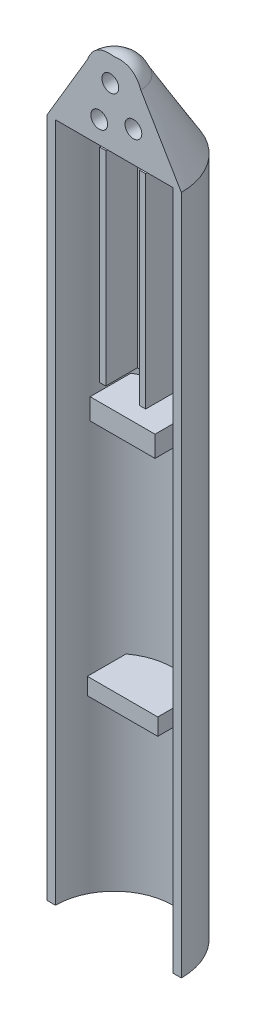
ISO-10303-21;
HEADER;
FILE_DESCRIPTION(('STEP AP214'),'2;1');
FILE_NAME('part.step','',(''),(''),'','','');
FILE_SCHEMA(('AUTOMOTIVE_DESIGN { 1 0 10303 214 1 1 1 1 }'));
ENDSEC;
DATA;
#1=APPLICATION_CONTEXT('core data for automotive mechanical design processes');
#2=APPLICATION_PROTOCOL_DEFINITION('international standard','automotive_design',2000,#1);
#3=PRODUCT_CONTEXT('',#1,'mechanical');
#4=PRODUCT('Part','Part','',(#3));
#5=PRODUCT_RELATED_PRODUCT_CATEGORY('part','',(#4));
#6=PRODUCT_DEFINITION_FORMATION('','',#4);
#7=PRODUCT_DEFINITION_CONTEXT('part definition',#1,'design');
#8=PRODUCT_DEFINITION('design','',#6,#7);
#9=PRODUCT_DEFINITION_SHAPE('','',#8);
#10=(LENGTH_UNIT() NAMED_UNIT(*) SI_UNIT(.MILLI.,.METRE.));
#11=(NAMED_UNIT(*) PLANE_ANGLE_UNIT() SI_UNIT($,.RADIAN.));
#12=(NAMED_UNIT(*) SI_UNIT($,.STERADIAN.) SOLID_ANGLE_UNIT());
#13=UNCERTAINTY_MEASURE_WITH_UNIT(LENGTH_MEASURE(1.E-05),#10,'distance_accuracy_value','');
#14=(GEOMETRIC_REPRESENTATION_CONTEXT(3) GLOBAL_UNCERTAINTY_ASSIGNED_CONTEXT((#13)) GLOBAL_UNIT_ASSIGNED_CONTEXT((#10,
#11,#12)) REPRESENTATION_CONTEXT('',''));
#15=CARTESIAN_POINT('',(0.,0.,0.));
#16=DIRECTION('',(0.,0.,1.));
#17=DIRECTION('',(1.,0.,0.));
#18=AXIS2_PLACEMENT_3D('',#15,#16,#17);
#19=CARTESIAN_POINT('',(-3.99999999999998,0.,-16.002));
#20=DIRECTION('',(1.,0.,0.));
#21=DIRECTION('',(0.,0.,-1.));
#22=AXIS2_PLACEMENT_3D('',#19,#20,#21);
#23=PLANE('',#22);
#24=DIRECTION('',(0.,0.,1.));
#25=VECTOR('',#24,1.);
#26=CARTESIAN_POINT('',(-3.99999999999998,20.0675731061453,-16.002));
#27=LINE('',#26,#25);
#28=CARTESIAN_POINT('',(-3.99999999999998,20.0675731061453,-9.5));
#29=VERTEX_POINT('',#28);
#30=CARTESIAN_POINT('',(-3.99999999999998,20.0675731061453,-2.));
#31=VERTEX_POINT('',#30);
#32=EDGE_CURVE('E66',#29,#31,#27,.T.);
#33=ORIENTED_EDGE('',*,*,#32,.F.);
#34=DIRECTION('',(0.,1.,0.));
#35=VECTOR('',#34,1.);
#36=CARTESIAN_POINT('',(-3.99999999999998,0.,-9.5));
#37=LINE('',#36,#35);
#38=CARTESIAN_POINT('',(-3.99999999999998,68.6220349905325,-9.5));
#39=VERTEX_POINT('',#38);
#40=EDGE_CURVE('E223',#29,#39,#37,.T.);
#41=ORIENTED_EDGE('',*,*,#40,.T.);
#42=DIRECTION('',(0.,0.,1.));
#43=VECTOR('',#42,1.);
#44=CARTESIAN_POINT('',(-3.99999999999998,68.6220349905325,-16.002));
#45=LINE('',#44,#43);
#46=CARTESIAN_POINT('',(-3.99999999999998,68.6220349905325,-2.));
#47=VERTEX_POINT('',#46);
#48=EDGE_CURVE('E212',#39,#47,#45,.T.);
#49=ORIENTED_EDGE('',*,*,#48,.T.);
#50=DIRECTION('',(0.,1.,0.));
#51=VECTOR('',#50,1.);
#52=CARTESIAN_POINT('',(-3.99999999999998,0.,-2.));
#53=LINE('',#52,#51);
#54=EDGE_CURVE('E240',#31,#47,#53,.T.);
#55=ORIENTED_EDGE('',*,*,#54,.F.);
#56=EDGE_LOOP('',(#33,#41,#49,#55));
#57=FACE_BOUND('',#56,.T.);
#58=ADVANCED_FACE('F47',(#57),#23,.T.);
#59=CARTESIAN_POINT('',(3.99999999999998,0.,-16.002));
#60=DIRECTION('',(1.,0.,0.));
#61=DIRECTION('',(0.,0.,-1.));
#62=AXIS2_PLACEMENT_3D('',#59,#60,#61);
#63=PLANE('',#62);
#64=DIRECTION('',(0.,1.,0.));
#65=VECTOR('',#64,1.);
#66=CARTESIAN_POINT('',(3.99999999999998,0.,-9.5));
#67=LINE('',#66,#65);
#68=CARTESIAN_POINT('',(3.99999999999998,20.0675731061453,-9.5));
#69=VERTEX_POINT('',#68);
#70=CARTESIAN_POINT('',(3.99999999999998,68.6220349905325,-9.5));
#71=VERTEX_POINT('',#70);
#72=EDGE_CURVE('E74',#69,#71,#67,.T.);
#73=ORIENTED_EDGE('',*,*,#72,.F.);
#74=DIRECTION('',(0.,0.,1.));
#75=VECTOR('',#74,1.);
#76=CARTESIAN_POINT('',(3.99999999999998,20.0675731061453,-16.002));
#77=LINE('',#76,#75);
#78=CARTESIAN_POINT('',(3.99999999999998,20.0675731061453,-2.));
#79=VERTEX_POINT('',#78);
#80=EDGE_CURVE('E316',#69,#79,#77,.T.);
#81=ORIENTED_EDGE('',*,*,#80,.T.);
#82=DIRECTION('',(0.,1.,0.));
#83=VECTOR('',#82,1.);
#84=CARTESIAN_POINT('',(3.99999999999998,0.,-2.));
#85=LINE('',#84,#83);
#86=CARTESIAN_POINT('',(3.99999999999998,68.6220349905325,-2.));
#87=VERTEX_POINT('',#86);
#88=EDGE_CURVE('E197',#79,#87,#85,.T.);
#89=ORIENTED_EDGE('',*,*,#88,.T.);
#90=DIRECTION('',(0.,0.,1.));
#91=VECTOR('',#90,1.);
#92=CARTESIAN_POINT('',(3.99999999999998,68.6220349905325,-16.002));
#93=LINE('',#92,#91);
#94=EDGE_CURVE('E191',#71,#87,#93,.T.);
#95=ORIENTED_EDGE('',*,*,#94,.F.);
#96=EDGE_LOOP('',(#73,#81,#89,#95));
#97=FACE_BOUND('',#96,.T.);
#98=ADVANCED_FACE('F196',(#97),#63,.F.);
#99=CARTESIAN_POINT('',(0.,91.,0.));
#100=DIRECTION('',(0.,1.,0.));
#101=DIRECTION('',(-1.,0.,0.));
#102=AXIS2_PLACEMENT_3D('',#99,#100,#101);
#103=CYLINDRICAL_SURFACE('',#102,14.);
#104=CARTESIAN_POINT('',(0.,-42.,0.));
#105=DIRECTION('',(0.,-1.,0.));
#106=DIRECTION('',(0.,0.,-1.));
#107=AXIS2_PLACEMENT_3D('',#104,#105,#106);
#108=CIRCLE('',#107,14.);
#109=CARTESIAN_POINT('',(-8.38159543616831,-42.,-11.2137798241451));
#110=VERTEX_POINT('',#109);
#111=CARTESIAN_POINT('',(8.38159543616828,-42.,-11.2137798241451));
#112=VERTEX_POINT('',#111);
#113=EDGE_CURVE('E292',#110,#112,#108,.T.);
#114=ORIENTED_EDGE('',*,*,#113,.T.);
#115=DIRECTION('',(0.,1.,0.));
#116=VECTOR('',#115,1.);
#117=CARTESIAN_POINT('',(8.38159543616828,91.,-11.2137798241451));
#118=LINE('',#117,#116);
#119=CARTESIAN_POINT('',(8.38159543616829,-46.,-11.2137798241451));
#120=VERTEX_POINT('',#119);
#121=EDGE_CURVE('E290',#120,#112,#118,.T.);
#122=ORIENTED_EDGE('',*,*,#121,.F.);
#123=CARTESIAN_POINT('',(0.,-46.,0.));
#124=DIRECTION('',(0.,-1.,0.));
#125=DIRECTION('',(0.,0.,-1.));
#126=AXIS2_PLACEMENT_3D('',#123,#124,#125);
#127=CIRCLE('',#126,14.);
#128=CARTESIAN_POINT('',(-8.38159543616832,-46.,-11.2137798241451));
#129=VERTEX_POINT('',#128);
#130=EDGE_CURVE('E294',#129,#120,#127,.T.);
#131=ORIENTED_EDGE('',*,*,#130,.F.);
#132=DIRECTION('',(0.,1.,0.));
#133=VECTOR('',#132,1.);
#134=CARTESIAN_POINT('',(-8.38159543616832,91.,-11.2137798241451));
#135=LINE('',#134,#133);
#136=EDGE_CURVE('E288',#129,#110,#135,.T.);
#137=ORIENTED_EDGE('',*,*,#136,.T.);
#138=EDGE_LOOP('',(#114,#122,#131,#137));
#139=FACE_BOUND('',#138,.T.);
#140=DIRECTION('',(0.,1.,0.));
#141=VECTOR('',#140,1.);
#142=CARTESIAN_POINT('',(14.,91.,0.));
#143=LINE('',#142,#141);
#144=CARTESIAN_POINT('',(14.,71.,0.));
#145=VERTEX_POINT('',#144);
#146=CARTESIAN_POINT('',(14.,-91.0399288571137,0.));
#147=VERTEX_POINT('',#146);
#148=EDGE_CURVE('E374',#145,#147,#143,.F.);
#149=ORIENTED_EDGE('',*,*,#148,.F.);
#150=CARTESIAN_POINT('',(0.,71.,0.));
#151=DIRECTION('',(0.,1.,0.));
#152=DIRECTION('',(-1.,0.,0.));
#153=AXIS2_PLACEMENT_3D('',#150,#151,#152);
#154=CIRCLE('',#153,14.);
#155=CARTESIAN_POINT('',(-14.,71.,0.));
#156=VERTEX_POINT('',#155);
#157=EDGE_CURVE('E56',#145,#156,#154,.T.);
#158=ORIENTED_EDGE('',*,*,#157,.T.);
#159=DIRECTION('',(0.,1.,0.));
#160=VECTOR('',#159,1.);
#161=CARTESIAN_POINT('',(-14.,91.,0.));
#162=LINE('',#161,#160);
#163=CARTESIAN_POINT('',(-14.,-91.0399288571137,0.));
#164=VERTEX_POINT('',#163);
#165=EDGE_CURVE('E365',#164,#156,#162,.T.);
#166=ORIENTED_EDGE('',*,*,#165,.F.);
#167=CARTESIAN_POINT('',(0.,-91.0399288571137,0.));
#168=DIRECTION('',(0.,1.,0.));
#169=DIRECTION('',(-1.,0.,0.));
#170=AXIS2_PLACEMENT_3D('',#167,#168,#169);
#171=CIRCLE('',#170,14.);
#172=EDGE_CURVE('E410',#147,#164,#171,.T.);
#173=ORIENTED_EDGE('',*,*,#172,.F.);
#174=EDGE_LOOP('',(#149,#158,#166,#173));
#175=FACE_BOUND('',#174,.T.);
#176=CARTESIAN_POINT('',(0.,16.,0.));
#177=DIRECTION('',(0.,-1.,0.));
#178=DIRECTION('',(1.,0.,0.));
#179=AXIS2_PLACEMENT_3D('',#176,#177,#178);
#180=CIRCLE('',#179,14.);
#181=CARTESIAN_POINT('',(-7.72890663595341,16.,-11.6732173034137));
#182=VERTEX_POINT('',#181);
#183=CARTESIAN_POINT('',(7.72890663595337,16.,-11.6732173034137));
#184=VERTEX_POINT('',#183);
#185=EDGE_CURVE('E361',#182,#184,#180,.T.);
#186=ORIENTED_EDGE('',*,*,#185,.T.);
#187=DIRECTION('',(0.,1.,0.));
#188=VECTOR('',#187,1.);
#189=CARTESIAN_POINT('',(7.72890663595337,91.,-11.6732173034136));
#190=LINE('',#189,#188);
#191=CARTESIAN_POINT('',(7.72890663595338,11.,-11.6732173034137));
#192=VERTEX_POINT('',#191);
#193=EDGE_CURVE('E356',#192,#184,#190,.T.);
#194=ORIENTED_EDGE('',*,*,#193,.F.);
#195=CARTESIAN_POINT('',(0.,11.,0.));
#196=DIRECTION('',(0.,-1.,0.));
#197=DIRECTION('',(1.,0.,0.));
#198=AXIS2_PLACEMENT_3D('',#195,#196,#197);
#199=CIRCLE('',#198,14.);
#200=CARTESIAN_POINT('',(-7.72890663595342,11.,-11.6732173034137));
#201=VERTEX_POINT('',#200);
#202=EDGE_CURVE('E366',#201,#192,#199,.T.);
#203=ORIENTED_EDGE('',*,*,#202,.F.);
#204=DIRECTION('',(0.,1.,0.));
#205=VECTOR('',#204,1.);
#206=CARTESIAN_POINT('',(-7.72890663595342,91.,-11.6732173034137));
#207=LINE('',#206,#205);
#208=EDGE_CURVE('E360',#201,#182,#207,.T.);
#209=ORIENTED_EDGE('',*,*,#208,.T.);
#210=EDGE_LOOP('',(#186,#194,#203,#209));
#211=FACE_BOUND('',#210,.T.);
#212=DIRECTION('',(0.,1.,0.));
#213=VECTOR('',#212,1.);
#214=CARTESIAN_POINT('',(-5.49999999999998,91.,-12.8743931895838));
#215=LINE('',#214,#213);
#216=CARTESIAN_POINT('',(-5.49999999999997,20.0675731061453,-12.8743931895838));
#217=VERTEX_POINT('',#216);
#218=CARTESIAN_POINT('',(-5.49999999999998,68.6220349905325,-12.8743931895838));
#219=VERTEX_POINT('',#218);
#220=EDGE_CURVE('E251',#217,#219,#215,.T.);
#221=ORIENTED_EDGE('',*,*,#220,.T.);
#222=CARTESIAN_POINT('',(0.,68.6220349905325,0.));
#223=DIRECTION('',(0.,1.,0.));
#224=DIRECTION('',(0.,0.,1.));
#225=AXIS2_PLACEMENT_3D('',#222,#223,#224);
#226=CIRCLE('',#225,14.);
#227=CARTESIAN_POINT('',(5.49999999999998,68.6220349905325,-12.8743931895837));
#228=VERTEX_POINT('',#227);
#229=EDGE_CURVE('E325',#228,#219,#226,.T.);
#230=ORIENTED_EDGE('',*,*,#229,.F.);
#231=DIRECTION('',(0.,1.,0.));
#232=VECTOR('',#231,1.);
#233=CARTESIAN_POINT('',(5.49999999999998,91.,-12.8743931895837));
#234=LINE('',#233,#232);
#235=CARTESIAN_POINT('',(5.49999999999998,20.0675731061453,-12.8743931895837));
#236=VERTEX_POINT('',#235);
#237=EDGE_CURVE('E323',#236,#228,#234,.T.);
#238=ORIENTED_EDGE('',*,*,#237,.F.);
#239=CARTESIAN_POINT('',(0.,20.0675731061453,0.));
#240=DIRECTION('',(0.,1.,0.));
#241=DIRECTION('',(0.,0.,1.));
#242=AXIS2_PLACEMENT_3D('',#239,#240,#241);
#243=CIRCLE('',#242,14.);
#244=EDGE_CURVE('E262',#236,#217,#243,.T.);
#245=ORIENTED_EDGE('',*,*,#244,.T.);
#246=EDGE_LOOP('',(#221,#230,#238,#245));
#247=FACE_BOUND('',#246,.T.);
#248=ADVANCED_FACE('F440',(#139,#175,#211,#247),#103,.F.);
#249=CARTESIAN_POINT('',(6.354000148981,87.2790396922268,0.));
#250=CARTESIAN_POINT('',(4.66858918472638,91.7236423414879,0.));
#251=CARTESIAN_POINT('',(0.,91.,0.));
#252=B_SPLINE_CURVE_WITH_KNOTS('',2,(#249,#250,#251),.UNSPECIFIED.,.F.,.F.,(3,3),(0.,1.),.UNSPECIFIED.);
#253=CARTESIAN_POINT('',(0.,91.,0.));
#254=DIRECTION('',(0.,1.,0.));
#255=AXIS1_PLACEMENT('',#253,#254);
#256=SURFACE_OF_REVOLUTION('',#252,#255);
#257=CARTESIAN_POINT('',(6.354000148981,87.2790396922268,0.));
#258=CARTESIAN_POINT('',(4.66858918472638,91.7236423414879,0.));
#259=CARTESIAN_POINT('',(0.,91.,0.));
#260=B_SPLINE_CURVE_WITH_KNOTS('',2,(#257,#258,#259),.UNSPECIFIED.,.F.,.F.,(3,3),(0.,1.),.UNSPECIFIED.);
#261=CARTESIAN_POINT('',(6.354000148981,87.2790396922268,0.));
#262=VERTEX_POINT('',#261);
#263=CARTESIAN_POINT('',(0.,91.,0.));
#264=VERTEX_POINT('',#263);
#265=EDGE_CURVE('E399',#262,#264,#260,.T.);
#266=ORIENTED_EDGE('',*,*,#265,.F.);
#267=CARTESIAN_POINT('',(0.,87.2790396922268,0.));
#268=DIRECTION('',(0.,1.,0.));
#269=DIRECTION('',(-1.,0.,0.));
#270=AXIS2_PLACEMENT_3D('',#267,#268,#269);
#271=CIRCLE('',#270,6.35400014898102);
#272=CARTESIAN_POINT('',(-6.35400014898104,87.2790396922268,0.));
#273=VERTEX_POINT('',#272);
#274=EDGE_CURVE('E423',#262,#273,#271,.T.);
#275=ORIENTED_EDGE('',*,*,#274,.T.);
#276=CARTESIAN_POINT('',(-6.35400014898105,87.2790396922268,0.));
#277=CARTESIAN_POINT('',(-4.66858918472643,91.7236423414879,0.));
#278=CARTESIAN_POINT('',(0.,91.,0.));
#279=B_SPLINE_CURVE_WITH_KNOTS('',2,(#276,#277,#278),.UNSPECIFIED.,.F.,.F.,(3,3),(0.,1.),.UNSPECIFIED.);
#280=EDGE_CURVE('E393',#264,#273,#279,.F.);
#281=ORIENTED_EDGE('',*,*,#280,.F.);
#282=EDGE_LOOP('',(#266,#275,#281));
#283=FACE_BOUND('',#282,.T.);
#284=ADVANCED_FACE('F51',(#283),#256,.T.);
#285=CARTESIAN_POINT('',(0.,71.,0.));
#286=DIRECTION('',(0.,-1.,0.));
#287=DIRECTION('',(1.,0.,0.));
#288=AXIS2_PLACEMENT_3D('',#285,#286,#287);
#289=CONICAL_SURFACE('',#288,16.,0.534916952487725);
#290=DIRECTION('',(-0.50976959450107,-0.860310967338099,0.));
#291=VECTOR('',#290,1.);
#292=CARTESIAN_POINT('',(0.,98.0023469934135,0.));
#293=LINE('',#292,#291);
#294=CARTESIAN_POINT('',(-16.,71.,0.));
#295=VERTEX_POINT('',#294);
#296=EDGE_CURVE('E391',#273,#295,#293,.T.);
#297=ORIENTED_EDGE('',*,*,#296,.F.);
#298=ORIENTED_EDGE('',*,*,#274,.F.);
#299=DIRECTION('',(-0.50976959450107,0.860310967338099,0.));
#300=VECTOR('',#299,1.);
#301=CARTESIAN_POINT('',(0.,98.0023469934135,0.));
#302=LINE('',#301,#300);
#303=CARTESIAN_POINT('',(16.,71.,0.));
#304=VERTEX_POINT('',#303);
#305=EDGE_CURVE('E389',#304,#262,#302,.T.);
#306=ORIENTED_EDGE('',*,*,#305,.F.);
#307=CARTESIAN_POINT('',(0.,71.,0.));
#308=DIRECTION('',(0.,1.,0.));
#309=DIRECTION('',(-1.,0.,0.));
#310=AXIS2_PLACEMENT_3D('',#307,#308,#309);
#311=CIRCLE('',#310,16.);
#312=EDGE_CURVE('E418',#304,#295,#311,.T.);
#313=ORIENTED_EDGE('',*,*,#312,.T.);
#314=EDGE_LOOP('',(#297,#298,#306,#313));
#315=FACE_BOUND('',#314,.T.);
#316=ADVANCED_FACE('F462',(#315),#289,.T.);
#317=CARTESIAN_POINT('',(0.,91.,0.));
#318=DIRECTION('',(0.,1.,0.));
#319=DIRECTION('',(-1.,0.,0.));
#320=AXIS2_PLACEMENT_3D('',#317,#318,#319);
#321=CYLINDRICAL_SURFACE('',#320,16.);
#322=DIRECTION('',(0.,1.,0.));
#323=VECTOR('',#322,1.);
#324=CARTESIAN_POINT('',(16.,91.,0.));
#325=LINE('',#324,#323);
#326=CARTESIAN_POINT('',(16.,-91.0399288571137,0.));
#327=VERTEX_POINT('',#326);
#328=EDGE_CURVE('E383',#327,#304,#325,.T.);
#329=ORIENTED_EDGE('',*,*,#328,.F.);
#330=CARTESIAN_POINT('',(0.,-91.0399288571137,0.));
#331=DIRECTION('',(0.,1.,0.));
#332=DIRECTION('',(-1.,0.,0.));
#333=AXIS2_PLACEMENT_3D('',#330,#331,#332);
#334=CIRCLE('',#333,16.);
#335=CARTESIAN_POINT('',(-16.,-91.0399288571137,0.));
#336=VERTEX_POINT('',#335);
#337=EDGE_CURVE('E413',#327,#336,#334,.T.);
#338=ORIENTED_EDGE('',*,*,#337,.T.);
#339=DIRECTION('',(0.,1.,0.));
#340=VECTOR('',#339,1.);
#341=CARTESIAN_POINT('',(-16.,91.,0.));
#342=LINE('',#341,#340);
#343=EDGE_CURVE('E385',#295,#336,#342,.F.);
#344=ORIENTED_EDGE('',*,*,#343,.F.);
#345=ORIENTED_EDGE('',*,*,#312,.F.);
#346=EDGE_LOOP('',(#329,#338,#344,#345));
#347=FACE_BOUND('',#346,.T.);
#348=ADVANCED_FACE('F451',(#347),#321,.T.);
#349=CARTESIAN_POINT('',(16.,-91.0399288571137,0.));
#350=DIRECTION('',(0.,1.,0.));
#351=DIRECTION('',(-1.,0.,0.));
#352=AXIS2_PLACEMENT_3D('',#349,#350,#351);
#353=PLANE('',#352);
#354=DIRECTION('',(1.,0.,0.));
#355=VECTOR('',#354,1.);
#356=CARTESIAN_POINT('',(16.,-91.0399288571137,0.));
#357=LINE('',#356,#355);
#358=EDGE_CURVE('E382',#336,#164,#357,.T.);
#359=ORIENTED_EDGE('',*,*,#358,.F.);
#360=ORIENTED_EDGE('',*,*,#337,.F.);
#361=EDGE_CURVE('E377',#147,#327,#357,.T.);
#362=ORIENTED_EDGE('',*,*,#361,.F.);
#363=ORIENTED_EDGE('',*,*,#172,.T.);
#364=EDGE_LOOP('',(#359,#360,#362,#363));
#365=FACE_BOUND('',#364,.T.);
#366=ADVANCED_FACE('F452',(#365),#353,.F.);
#367=CARTESIAN_POINT('',(16.,71.,0.));
#368=DIRECTION('',(0.,1.,0.));
#369=DIRECTION('',(-1.,0.,0.));
#370=AXIS2_PLACEMENT_3D('',#367,#368,#369);
#371=PLANE('',#370);
#372=DIRECTION('',(1.,0.,0.));
#373=VECTOR('',#372,1.);
#374=CARTESIAN_POINT('',(16.,71.,0.));
#375=LINE('',#374,#373);
#376=EDGE_CURVE('E11',#156,#145,#375,.T.);
#377=ORIENTED_EDGE('',*,*,#376,.F.);
#378=ORIENTED_EDGE('',*,*,#157,.F.);
#379=EDGE_LOOP('',(#377,#378));
#380=FACE_BOUND('',#379,.T.);
#381=ADVANCED_FACE('F445',(#380),#371,.F.);
#382=CARTESIAN_POINT('',(0.,0.,0.));
#383=DIRECTION('',(0.,0.,1.));
#384=DIRECTION('',(1.,0.,0.));
#385=AXIS2_PLACEMENT_3D('',#382,#383,#384);
#386=PLANE('',#385);
#387=CARTESIAN_POINT('',(4.57930185841874,78.3675125372892,0.));
#388=DIRECTION('',(0.,0.,1.));
#389=DIRECTION('',(1.,0.,0.));
#390=AXIS2_PLACEMENT_3D('',#387,#388,#389);
#391=CIRCLE('',#390,2.);
#392=CARTESIAN_POINT('',(6.57930185841874,78.3675125372892,0.));
#393=VERTEX_POINT('',#392);
#394=EDGE_CURVE('E740',#393,#393,#391,.T.);
#395=ORIENTED_EDGE('',*,*,#394,.F.);
#396=EDGE_LOOP('',(#395));
#397=FACE_BOUND('',#396,.T.);
#398=CARTESIAN_POINT('',(-3.55851338451132,76.2554078177501,0.));
#399=DIRECTION('',(0.,0.,1.));
#400=DIRECTION('',(1.,0.,0.));
#401=AXIS2_PLACEMENT_3D('',#398,#399,#400);
#402=CIRCLE('',#401,2.);
#403=CARTESIAN_POINT('',(-1.55851338451132,76.2554078177501,0.));
#404=VERTEX_POINT('',#403);
#405=EDGE_CURVE('E742',#404,#404,#402,.T.);
#406=ORIENTED_EDGE('',*,*,#405,.F.);
#407=EDGE_LOOP('',(#406));
#408=FACE_BOUND('',#407,.T.);
#409=CARTESIAN_POINT('',(-0.919296183297679,85.0765510581781,0.));
#410=DIRECTION('',(0.,0.,1.));
#411=DIRECTION('',(1.,0.,0.));
#412=AXIS2_PLACEMENT_3D('',#409,#410,#411);
#413=CIRCLE('',#412,2.);
#414=CARTESIAN_POINT('',(1.08070381670232,85.0765510581781,0.));
#415=VERTEX_POINT('',#414);
#416=EDGE_CURVE('E753',#415,#415,#413,.T.);
#417=ORIENTED_EDGE('',*,*,#416,.F.);
#418=EDGE_LOOP('',(#417));
#419=FACE_BOUND('',#418,.T.);
#420=ORIENTED_EDGE('',*,*,#265,.T.);
#421=ORIENTED_EDGE('',*,*,#280,.T.);
#422=ORIENTED_EDGE('',*,*,#296,.T.);
#423=ORIENTED_EDGE('',*,*,#343,.T.);
#424=ORIENTED_EDGE('',*,*,#358,.T.);
#425=ORIENTED_EDGE('',*,*,#165,.T.);
#426=ORIENTED_EDGE('',*,*,#376,.T.);
#427=ORIENTED_EDGE('',*,*,#148,.T.);
#428=ORIENTED_EDGE('',*,*,#361,.T.);
#429=ORIENTED_EDGE('',*,*,#328,.T.);
#430=ORIENTED_EDGE('',*,*,#305,.T.);
#431=EDGE_LOOP('',(#420,#421,#422,#423,#424,#425,#426,#427,#428,#429,#430));
#432=FACE_BOUND('',#431,.T.);
#433=ADVANCED_FACE('F443',(#397,#408,#419,#432),#386,.T.);
#434=CARTESIAN_POINT('',(7.72890663595337,0.,-16.002));
#435=DIRECTION('',(1.,0.,0.));
#436=DIRECTION('',(0.,0.,-1.));
#437=AXIS2_PLACEMENT_3D('',#434,#435,#436);
#438=PLANE('',#437);
#439=DIRECTION('',(0.,0.,1.));
#440=VECTOR('',#439,1.);
#441=CARTESIAN_POINT('',(7.72890663595337,11.,-16.002));
#442=LINE('',#441,#440);
#443=CARTESIAN_POINT('',(7.72890663595337,11.,-2.));
#444=VERTEX_POINT('',#443);
#445=EDGE_CURVE('E351',#192,#444,#442,.T.);
#446=ORIENTED_EDGE('',*,*,#445,.F.);
#447=ORIENTED_EDGE('',*,*,#193,.T.);
#448=DIRECTION('',(0.,0.,1.));
#449=VECTOR('',#448,1.);
#450=CARTESIAN_POINT('',(7.72890663595337,16.,-16.002));
#451=LINE('',#450,#449);
#452=CARTESIAN_POINT('',(7.72890663595337,16.,-2.));
#453=VERTEX_POINT('',#452);
#454=EDGE_CURVE('E355',#184,#453,#451,.T.);
#455=ORIENTED_EDGE('',*,*,#454,.T.);
#456=DIRECTION('',(0.,1.,0.));
#457=VECTOR('',#456,1.);
#458=CARTESIAN_POINT('',(7.72890663595337,0.,-2.));
#459=LINE('',#458,#457);
#460=EDGE_CURVE('E334',#444,#453,#459,.T.);
#461=ORIENTED_EDGE('',*,*,#460,.F.);
#462=EDGE_LOOP('',(#446,#447,#455,#461));
#463=FACE_BOUND('',#462,.T.);
#464=ADVANCED_FACE('F486',(#463),#438,.T.);
#465=CARTESIAN_POINT('',(0.,16.,-16.002));
#466=DIRECTION('',(0.,-1.,0.));
#467=DIRECTION('',(1.,0.,0.));
#468=AXIS2_PLACEMENT_3D('',#465,#466,#467);
#469=PLANE('',#468);
#470=ORIENTED_EDGE('',*,*,#185,.F.);
#471=DIRECTION('',(0.,0.,1.));
#472=VECTOR('',#471,1.);
#473=CARTESIAN_POINT('',(-7.72890663595342,16.,-16.002));
#474=LINE('',#473,#472);
#475=CARTESIAN_POINT('',(-7.72890663595342,16.,-2.));
#476=VERTEX_POINT('',#475);
#477=EDGE_CURVE('E348',#182,#476,#474,.T.);
#478=ORIENTED_EDGE('',*,*,#477,.T.);
#479=DIRECTION('',(1.,0.,0.));
#480=VECTOR('',#479,1.);
#481=CARTESIAN_POINT('',(0.,16.,-2.));
#482=LINE('',#481,#480);
#483=EDGE_CURVE('E336',#476,#453,#482,.T.);
#484=ORIENTED_EDGE('',*,*,#483,.T.);
#485=ORIENTED_EDGE('',*,*,#454,.F.);
#486=EDGE_LOOP('',(#470,#478,#484,#485));
#487=FACE_BOUND('',#486,.T.);
#488=ADVANCED_FACE('F524',(#487),#469,.F.);
#489=CARTESIAN_POINT('',(0.,0.,-2.));
#490=DIRECTION('',(0.,0.,1.));
#491=DIRECTION('',(1.,0.,0.));
#492=AXIS2_PLACEMENT_3D('',#489,#490,#491);
#493=PLANE('',#492);
#494=DIRECTION('',(1.,0.,0.));
#495=VECTOR('',#494,1.);
#496=CARTESIAN_POINT('',(0.,11.,-2.));
#497=LINE('',#496,#495);
#498=CARTESIAN_POINT('',(-7.72890663595342,11.,-2.));
#499=VERTEX_POINT('',#498);
#500=EDGE_CURVE('E293',#499,#444,#497,.T.);
#501=ORIENTED_EDGE('',*,*,#500,.T.);
#502=ORIENTED_EDGE('',*,*,#460,.T.);
#503=ORIENTED_EDGE('',*,*,#483,.F.);
#504=DIRECTION('',(0.,1.,0.));
#505=VECTOR('',#504,1.);
#506=CARTESIAN_POINT('',(-7.72890663595342,0.,-2.));
#507=LINE('',#506,#505);
#508=EDGE_CURVE('E345',#499,#476,#507,.T.);
#509=ORIENTED_EDGE('',*,*,#508,.F.);
#510=EDGE_LOOP('',(#501,#502,#503,#509));
#511=FACE_BOUND('',#510,.T.);
#512=ADVANCED_FACE('F521',(#511),#493,.T.);
#513=CARTESIAN_POINT('',(0.,11.,-16.002));
#514=DIRECTION('',(0.,-1.,0.));
#515=DIRECTION('',(1.,0.,0.));
#516=AXIS2_PLACEMENT_3D('',#513,#514,#515);
#517=PLANE('',#516);
#518=DIRECTION('',(0.,0.,1.));
#519=VECTOR('',#518,1.);
#520=CARTESIAN_POINT('',(-7.72890663595342,11.,-16.002));
#521=LINE('',#520,#519);
#522=EDGE_CURVE('E346',#201,#499,#521,.T.);
#523=ORIENTED_EDGE('',*,*,#522,.F.);
#524=ORIENTED_EDGE('',*,*,#202,.T.);
#525=ORIENTED_EDGE('',*,*,#445,.T.);
#526=ORIENTED_EDGE('',*,*,#500,.F.);
#527=EDGE_LOOP('',(#523,#524,#525,#526));
#528=FACE_BOUND('',#527,.T.);
#529=ADVANCED_FACE('F523',(#528),#517,.T.);
#530=CARTESIAN_POINT('',(-7.72890663595342,0.,-16.002));
#531=DIRECTION('',(1.,0.,0.));
#532=DIRECTION('',(0.,0.,-1.));
#533=AXIS2_PLACEMENT_3D('',#530,#531,#532);
#534=PLANE('',#533);
#535=ORIENTED_EDGE('',*,*,#208,.F.);
#536=ORIENTED_EDGE('',*,*,#522,.T.);
#537=ORIENTED_EDGE('',*,*,#508,.T.);
#538=ORIENTED_EDGE('',*,*,#477,.F.);
#539=EDGE_LOOP('',(#535,#536,#537,#538));
#540=FACE_BOUND('',#539,.T.);
#541=ADVANCED_FACE('F530',(#540),#534,.F.);
#542=CARTESIAN_POINT('',(0.,0.,-2.));
#543=DIRECTION('',(0.,0.,1.));
#544=DIRECTION('',(1.,0.,0.));
#545=AXIS2_PLACEMENT_3D('',#542,#543,#544);
#546=PLANE('',#545);
#547=DIRECTION('',(0.,1.,0.));
#548=VECTOR('',#547,1.);
#549=CARTESIAN_POINT('',(-5.49999999999998,0.,-2.));
#550=LINE('',#549,#548);
#551=CARTESIAN_POINT('',(-5.49999999999998,20.0675731061453,-2.));
#552=VERTEX_POINT('',#551);
#553=CARTESIAN_POINT('',(-5.49999999999998,68.6220349905325,-2.));
#554=VERTEX_POINT('',#553);
#555=EDGE_CURVE('E230',#552,#554,#550,.T.);
#556=ORIENTED_EDGE('',*,*,#555,.F.);
#557=DIRECTION('',(1.,0.,0.));
#558=VECTOR('',#557,1.);
#559=CARTESIAN_POINT('',(0.,20.0675731061453,-2.));
#560=LINE('',#559,#558);
#561=EDGE_CURVE('E231',#552,#31,#560,.T.);
#562=ORIENTED_EDGE('',*,*,#561,.T.);
#563=ORIENTED_EDGE('',*,*,#54,.T.);
#564=DIRECTION('',(1.,0.,0.));
#565=VECTOR('',#564,1.);
#566=CARTESIAN_POINT('',(0.,68.6220349905325,-2.));
#567=LINE('',#566,#565);
#568=EDGE_CURVE('E241',#554,#47,#567,.T.);
#569=ORIENTED_EDGE('',*,*,#568,.F.);
#570=EDGE_LOOP('',(#556,#562,#563,#569));
#571=FACE_BOUND('',#570,.T.);
#572=ADVANCED_FACE('F482',(#571),#546,.T.);
#573=CARTESIAN_POINT('',(-5.49999999999998,0.,-16.002));
#574=DIRECTION('',(1.,0.,0.));
#575=DIRECTION('',(0.,0.,-1.));
#576=AXIS2_PLACEMENT_3D('',#573,#574,#575);
#577=PLANE('',#576);
#578=ORIENTED_EDGE('',*,*,#220,.F.);
#579=DIRECTION('',(0.,0.,1.));
#580=VECTOR('',#579,1.);
#581=CARTESIAN_POINT('',(-5.49999999999998,20.0675731061453,-16.002));
#582=LINE('',#581,#580);
#583=EDGE_CURVE('E252',#217,#552,#582,.T.);
#584=ORIENTED_EDGE('',*,*,#583,.T.);
#585=ORIENTED_EDGE('',*,*,#555,.T.);
#586=DIRECTION('',(0.,0.,1.));
#587=VECTOR('',#586,1.);
#588=CARTESIAN_POINT('',(-5.49999999999998,68.6220349905325,-16.002));
#589=LINE('',#588,#587);
#590=EDGE_CURVE('E242',#219,#554,#589,.T.);
#591=ORIENTED_EDGE('',*,*,#590,.F.);
#592=EDGE_LOOP('',(#578,#584,#585,#591));
#593=FACE_BOUND('',#592,.T.);
#594=ADVANCED_FACE('F483',(#593),#577,.F.);
#595=CARTESIAN_POINT('',(0.,20.0675731061453,-16.002));
#596=DIRECTION('',(0.,1.,0.));
#597=DIRECTION('',(0.,0.,1.));
#598=AXIS2_PLACEMENT_3D('',#595,#596,#597);
#599=PLANE('',#598);
#600=ORIENTED_EDGE('',*,*,#244,.F.);
#601=DIRECTION('',(0.,0.,1.));
#602=VECTOR('',#601,1.);
#603=CARTESIAN_POINT('',(5.49999999999998,20.0675731061453,-16.002));
#604=LINE('',#603,#602);
#605=CARTESIAN_POINT('',(5.49999999999998,20.0675731061453,-2.));
#606=VERTEX_POINT('',#605);
#607=EDGE_CURVE('E317',#236,#606,#604,.T.);
#608=ORIENTED_EDGE('',*,*,#607,.T.);
#609=DIRECTION('',(-1.,0.,0.));
#610=VECTOR('',#609,1.);
#611=CARTESIAN_POINT('',(0.,20.0675731061453,-2.));
#612=LINE('',#611,#610);
#613=EDGE_CURVE('E302',#606,#79,#612,.T.);
#614=ORIENTED_EDGE('',*,*,#613,.T.);
#615=ORIENTED_EDGE('',*,*,#80,.F.);
#616=DIRECTION('',(1.,0.,0.));
#617=VECTOR('',#616,1.);
#618=CARTESIAN_POINT('',(0.,20.0675731061453,-9.5));
#619=LINE('',#618,#617);
#620=EDGE_CURVE('E218',#29,#69,#619,.T.);
#621=ORIENTED_EDGE('',*,*,#620,.F.);
#622=ORIENTED_EDGE('',*,*,#32,.T.);
#623=ORIENTED_EDGE('',*,*,#561,.F.);
#624=ORIENTED_EDGE('',*,*,#583,.F.);
#625=EDGE_LOOP('',(#600,#608,#614,#615,#621,#622,#623,#624));
#626=FACE_BOUND('',#625,.T.);
#627=ADVANCED_FACE('F488',(#626),#599,.F.);
#628=CARTESIAN_POINT('',(0.,0.,-2.));
#629=DIRECTION('',(0.,0.,1.));
#630=DIRECTION('',(1.,0.,0.));
#631=AXIS2_PLACEMENT_3D('',#628,#629,#630);
#632=PLANE('',#631);
#633=ORIENTED_EDGE('',*,*,#88,.F.);
#634=ORIENTED_EDGE('',*,*,#613,.F.);
#635=DIRECTION('',(0.,1.,0.));
#636=VECTOR('',#635,1.);
#637=CARTESIAN_POINT('',(5.49999999999998,0.,-2.));
#638=LINE('',#637,#636);
#639=CARTESIAN_POINT('',(5.49999999999998,68.6220349905325,-2.));
#640=VERTEX_POINT('',#639);
#641=EDGE_CURVE('E308',#606,#640,#638,.T.);
#642=ORIENTED_EDGE('',*,*,#641,.T.);
#643=DIRECTION('',(-1.,0.,0.));
#644=VECTOR('',#643,1.);
#645=CARTESIAN_POINT('',(0.,68.6220349905325,-2.));
#646=LINE('',#645,#644);
#647=EDGE_CURVE('E204',#640,#87,#646,.T.);
#648=ORIENTED_EDGE('',*,*,#647,.T.);
#649=EDGE_LOOP('',(#633,#634,#642,#648));
#650=FACE_BOUND('',#649,.T.);
#651=ADVANCED_FACE('F507',(#650),#632,.T.);
#652=CARTESIAN_POINT('',(5.49999999999998,0.,-16.002));
#653=DIRECTION('',(1.,0.,0.));
#654=DIRECTION('',(0.,0.,-1.));
#655=AXIS2_PLACEMENT_3D('',#652,#653,#654);
#656=PLANE('',#655);
#657=ORIENTED_EDGE('',*,*,#607,.F.);
#658=ORIENTED_EDGE('',*,*,#237,.T.);
#659=DIRECTION('',(0.,0.,1.));
#660=VECTOR('',#659,1.);
#661=CARTESIAN_POINT('',(5.49999999999998,68.6220349905325,-16.002));
#662=LINE('',#661,#660);
#663=EDGE_CURVE('E203',#228,#640,#662,.T.);
#664=ORIENTED_EDGE('',*,*,#663,.T.);
#665=ORIENTED_EDGE('',*,*,#641,.F.);
#666=EDGE_LOOP('',(#657,#658,#664,#665));
#667=FACE_BOUND('',#666,.T.);
#668=ADVANCED_FACE('F512',(#667),#656,.T.);
#669=CARTESIAN_POINT('',(0.,68.6220349905325,-16.002));
#670=DIRECTION('',(0.,1.,0.));
#671=DIRECTION('',(0.,0.,1.));
#672=AXIS2_PLACEMENT_3D('',#669,#670,#671);
#673=PLANE('',#672);
#674=ORIENTED_EDGE('',*,*,#663,.F.);
#675=ORIENTED_EDGE('',*,*,#229,.T.);
#676=ORIENTED_EDGE('',*,*,#590,.T.);
#677=ORIENTED_EDGE('',*,*,#568,.T.);
#678=ORIENTED_EDGE('',*,*,#48,.F.);
#679=DIRECTION('',(1.,0.,0.));
#680=VECTOR('',#679,1.);
#681=CARTESIAN_POINT('',(0.,68.6220349905325,-9.5));
#682=LINE('',#681,#680);
#683=EDGE_CURVE('E206',#39,#71,#682,.T.);
#684=ORIENTED_EDGE('',*,*,#683,.T.);
#685=ORIENTED_EDGE('',*,*,#94,.T.);
#686=ORIENTED_EDGE('',*,*,#647,.F.);
#687=EDGE_LOOP('',(#674,#675,#676,#677,#678,#684,#685,#686));
#688=FACE_BOUND('',#687,.T.);
#689=ADVANCED_FACE('F209',(#688),#673,.T.);
#690=CARTESIAN_POINT('',(8.38159543616828,0.,-16.002));
#691=DIRECTION('',(1.,0.,0.));
#692=DIRECTION('',(0.,0.,-1.));
#693=AXIS2_PLACEMENT_3D('',#690,#691,#692);
#694=PLANE('',#693);
#695=DIRECTION('',(0.,0.,1.));
#696=VECTOR('',#695,1.);
#697=CARTESIAN_POINT('',(8.38159543616828,-46.,-16.002));
#698=LINE('',#697,#696);
#699=CARTESIAN_POINT('',(8.38159543616828,-46.,-2.));
#700=VERTEX_POINT('',#699);
#701=EDGE_CURVE('E283',#120,#700,#698,.T.);
#702=ORIENTED_EDGE('',*,*,#701,.F.);
#703=ORIENTED_EDGE('',*,*,#121,.T.);
#704=DIRECTION('',(0.,0.,1.));
#705=VECTOR('',#704,1.);
#706=CARTESIAN_POINT('',(8.38159543616828,-42.,-16.002));
#707=LINE('',#706,#705);
#708=CARTESIAN_POINT('',(8.38159543616828,-42.,-2.));
#709=VERTEX_POINT('',#708);
#710=EDGE_CURVE('E281',#112,#709,#707,.T.);
#711=ORIENTED_EDGE('',*,*,#710,.T.);
#712=DIRECTION('',(0.,1.,0.));
#713=VECTOR('',#712,1.);
#714=CARTESIAN_POINT('',(8.38159543616828,0.,-2.));
#715=LINE('',#714,#713);
#716=EDGE_CURVE('E265',#700,#709,#715,.T.);
#717=ORIENTED_EDGE('',*,*,#716,.F.);
#718=EDGE_LOOP('',(#702,#703,#711,#717));
#719=FACE_BOUND('',#718,.T.);
#720=ADVANCED_FACE('F499',(#719),#694,.T.);
#721=CARTESIAN_POINT('',(0.,-42.,-16.002));
#722=DIRECTION('',(0.,-1.,0.));
#723=DIRECTION('',(0.,0.,-1.));
#724=AXIS2_PLACEMENT_3D('',#721,#722,#723);
#725=PLANE('',#724);
#726=ORIENTED_EDGE('',*,*,#113,.F.);
#727=DIRECTION('',(0.,0.,1.));
#728=VECTOR('',#727,1.);
#729=CARTESIAN_POINT('',(-8.38159543616832,-42.,-16.002));
#730=LINE('',#729,#728);
#731=CARTESIAN_POINT('',(-8.38159543616832,-42.,-2.));
#732=VERTEX_POINT('',#731);
#733=EDGE_CURVE('E279',#110,#732,#730,.T.);
#734=ORIENTED_EDGE('',*,*,#733,.T.);
#735=DIRECTION('',(1.,0.,0.));
#736=VECTOR('',#735,1.);
#737=CARTESIAN_POINT('',(0.,-42.,-2.));
#738=LINE('',#737,#736);
#739=EDGE_CURVE('E270',#732,#709,#738,.T.);
#740=ORIENTED_EDGE('',*,*,#739,.T.);
#741=ORIENTED_EDGE('',*,*,#710,.F.);
#742=EDGE_LOOP('',(#726,#734,#740,#741));
#743=FACE_BOUND('',#742,.T.);
#744=ADVANCED_FACE('F491',(#743),#725,.F.);
#745=CARTESIAN_POINT('',(0.,0.,-2.));
#746=DIRECTION('',(0.,0.,1.));
#747=DIRECTION('',(1.,0.,0.));
#748=AXIS2_PLACEMENT_3D('',#745,#746,#747);
#749=PLANE('',#748);
#750=DIRECTION('',(1.,0.,0.));
#751=VECTOR('',#750,1.);
#752=CARTESIAN_POINT('',(0.,-46.,-2.));
#753=LINE('',#752,#751);
#754=CARTESIAN_POINT('',(-8.38159543616832,-46.,-2.));
#755=VERTEX_POINT('',#754);
#756=EDGE_CURVE('E259',#755,#700,#753,.T.);
#757=ORIENTED_EDGE('',*,*,#756,.T.);
#758=ORIENTED_EDGE('',*,*,#716,.T.);
#759=ORIENTED_EDGE('',*,*,#739,.F.);
#760=DIRECTION('',(0.,1.,0.));
#761=VECTOR('',#760,1.);
#762=CARTESIAN_POINT('',(-8.38159543616832,0.,-2.));
#763=LINE('',#762,#761);
#764=EDGE_CURVE('E272',#755,#732,#763,.T.);
#765=ORIENTED_EDGE('',*,*,#764,.F.);
#766=EDGE_LOOP('',(#757,#758,#759,#765));
#767=FACE_BOUND('',#766,.T.);
#768=ADVANCED_FACE('F490',(#767),#749,.T.);
#769=CARTESIAN_POINT('',(0.,-46.,-16.002));
#770=DIRECTION('',(0.,-1.,0.));
#771=DIRECTION('',(0.,0.,-1.));
#772=AXIS2_PLACEMENT_3D('',#769,#770,#771);
#773=PLANE('',#772);
#774=DIRECTION('',(0.,0.,1.));
#775=VECTOR('',#774,1.);
#776=CARTESIAN_POINT('',(-8.38159543616832,-46.,-16.002));
#777=LINE('',#776,#775);
#778=EDGE_CURVE('E273',#129,#755,#777,.T.);
#779=ORIENTED_EDGE('',*,*,#778,.F.);
#780=ORIENTED_EDGE('',*,*,#130,.T.);
#781=ORIENTED_EDGE('',*,*,#701,.T.);
#782=ORIENTED_EDGE('',*,*,#756,.F.);
#783=EDGE_LOOP('',(#779,#780,#781,#782));
#784=FACE_BOUND('',#783,.T.);
#785=ADVANCED_FACE('F495',(#784),#773,.T.);
#786=CARTESIAN_POINT('',(-8.38159543616832,0.,-16.002));
#787=DIRECTION('',(1.,0.,0.));
#788=DIRECTION('',(0.,0.,-1.));
#789=AXIS2_PLACEMENT_3D('',#786,#787,#788);
#790=PLANE('',#789);
#791=ORIENTED_EDGE('',*,*,#136,.F.);
#792=ORIENTED_EDGE('',*,*,#778,.T.);
#793=ORIENTED_EDGE('',*,*,#764,.T.);
#794=ORIENTED_EDGE('',*,*,#733,.F.);
#795=EDGE_LOOP('',(#791,#792,#793,#794));
#796=FACE_BOUND('',#795,.T.);
#797=ADVANCED_FACE('F492',(#796),#790,.F.);
#798=CARTESIAN_POINT('',(0.,0.,-9.5));
#799=DIRECTION('',(0.,0.,1.));
#800=DIRECTION('',(1.,0.,0.));
#801=AXIS2_PLACEMENT_3D('',#798,#799,#800);
#802=PLANE('',#801);
#803=ORIENTED_EDGE('',*,*,#40,.F.);
#804=ORIENTED_EDGE('',*,*,#620,.T.);
#805=ORIENTED_EDGE('',*,*,#72,.T.);
#806=ORIENTED_EDGE('',*,*,#683,.F.);
#807=EDGE_LOOP('',(#803,#804,#805,#806));
#808=FACE_BOUND('',#807,.T.);
#809=ADVANCED_FACE('F217',(#808),#802,.T.);
#810=CARTESIAN_POINT('',(-0.919296183297679,85.0765510581781,-4.));
#811=DIRECTION('',(0.,0.,1.));
#812=DIRECTION('',(1.,0.,0.));
#813=AXIS2_PLACEMENT_3D('',#810,#811,#812);
#814=CYLINDRICAL_SURFACE('',#813,2.);
#815=CARTESIAN_POINT('',(-0.919296183297679,85.0765510581781,-4.));
#816=DIRECTION('',(0.,0.,1.));
#817=DIRECTION('',(1.,0.,0.));
#818=AXIS2_PLACEMENT_3D('',#815,#816,#817);
#819=CIRCLE('',#818,2.);
#820=CARTESIAN_POINT('',(1.08070381670232,85.0765510581781,-4.));
#821=VERTEX_POINT('',#820);
#822=EDGE_CURVE('E754',#821,#821,#819,.T.);
#823=ORIENTED_EDGE('',*,*,#822,.F.);
#824=EDGE_LOOP('',(#823));
#825=FACE_BOUND('',#824,.T.);
#826=ORIENTED_EDGE('',*,*,#416,.T.);
#827=EDGE_LOOP('',(#826));
#828=FACE_BOUND('',#827,.T.);
#829=ADVANCED_FACE('F663',(#825,#828),#814,.F.);
#830=CARTESIAN_POINT('',(-0.919296183297679,85.0765510581781,-4.));
#831=DIRECTION('',(0.,0.,1.));
#832=DIRECTION('',(1.,0.,0.));
#833=AXIS2_PLACEMENT_3D('',#830,#831,#832);
#834=PLANE('',#833);
#835=ORIENTED_EDGE('',*,*,#822,.T.);
#836=EDGE_LOOP('',(#835));
#837=FACE_BOUND('',#836,.T.);
#838=ADVANCED_FACE('F678',(#837),#834,.T.);
#839=CARTESIAN_POINT('',(-3.55851338451132,76.2554078177501,-4.));
#840=DIRECTION('',(0.,0.,1.));
#841=DIRECTION('',(1.,0.,0.));
#842=AXIS2_PLACEMENT_3D('',#839,#840,#841);
#843=CYLINDRICAL_SURFACE('',#842,2.);
#844=CARTESIAN_POINT('',(-3.55851338451132,76.2554078177501,-4.));
#845=DIRECTION('',(0.,0.,1.));
#846=DIRECTION('',(1.,0.,0.));
#847=AXIS2_PLACEMENT_3D('',#844,#845,#846);
#848=CIRCLE('',#847,2.);
#849=CARTESIAN_POINT('',(-1.55851338451132,76.2554078177501,-4.));
#850=VERTEX_POINT('',#849);
#851=EDGE_CURVE('E747',#850,#850,#848,.T.);
#852=ORIENTED_EDGE('',*,*,#851,.F.);
#853=EDGE_LOOP('',(#852));
#854=FACE_BOUND('',#853,.T.);
#855=ORIENTED_EDGE('',*,*,#405,.T.);
#856=EDGE_LOOP('',(#855));
#857=FACE_BOUND('',#856,.T.);
#858=ADVANCED_FACE('F690',(#854,#857),#843,.F.);
#859=CARTESIAN_POINT('',(-3.55851338451132,76.2554078177501,-4.));
#860=DIRECTION('',(0.,0.,1.));
#861=DIRECTION('',(1.,0.,0.));
#862=AXIS2_PLACEMENT_3D('',#859,#860,#861);
#863=PLANE('',#862);
#864=ORIENTED_EDGE('',*,*,#851,.T.);
#865=EDGE_LOOP('',(#864));
#866=FACE_BOUND('',#865,.T.);
#867=ADVANCED_FACE('F696',(#866),#863,.T.);
#868=CARTESIAN_POINT('',(4.57930185841874,78.3675125372892,-4.));
#869=DIRECTION('',(0.,0.,1.));
#870=DIRECTION('',(1.,0.,0.));
#871=AXIS2_PLACEMENT_3D('',#868,#869,#870);
#872=CYLINDRICAL_SURFACE('',#871,2.);
#873=CARTESIAN_POINT('',(4.57930185841874,78.3675125372892,-4.));
#874=DIRECTION('',(0.,0.,1.));
#875=DIRECTION('',(1.,0.,0.));
#876=AXIS2_PLACEMENT_3D('',#873,#874,#875);
#877=CIRCLE('',#876,2.);
#878=CARTESIAN_POINT('',(6.57930185841874,78.3675125372892,-4.));
#879=VERTEX_POINT('',#878);
#880=EDGE_CURVE('E213',#879,#879,#877,.T.);
#881=ORIENTED_EDGE('',*,*,#880,.F.);
#882=EDGE_LOOP('',(#881));
#883=FACE_BOUND('',#882,.T.);
#884=ORIENTED_EDGE('',*,*,#394,.T.);
#885=EDGE_LOOP('',(#884));
#886=FACE_BOUND('',#885,.T.);
#887=ADVANCED_FACE('F704',(#883,#886),#872,.F.);
#888=CARTESIAN_POINT('',(4.57930185841874,78.3675125372892,-4.));
#889=DIRECTION('',(0.,0.,1.));
#890=DIRECTION('',(1.,0.,0.));
#891=AXIS2_PLACEMENT_3D('',#888,#889,#890);
#892=PLANE('',#891);
#893=ORIENTED_EDGE('',*,*,#880,.T.);
#894=EDGE_LOOP('',(#893));
#895=FACE_BOUND('',#894,.T.);
#896=ADVANCED_FACE('F711',(#895),#892,.T.);
#897=CLOSED_SHELL('',(#58,#98,#248,#284,#316,#348,#366,#381,#433,#464,#488,#512,#529,#541,#572,
#594,#627,#651,#668,#689,#720,#744,#768,#785,#797,#809,#829,#838,#858,#867,#887,#896));
#898=MANIFOLD_SOLID_BREP('B2',#897);
#899=ADVANCED_BREP_SHAPE_REPRESENTATION('',(#18,#898),#14);
#900=SHAPE_DEFINITION_REPRESENTATION(#9,#899);
ENDSEC;
END-ISO-10303-21;
